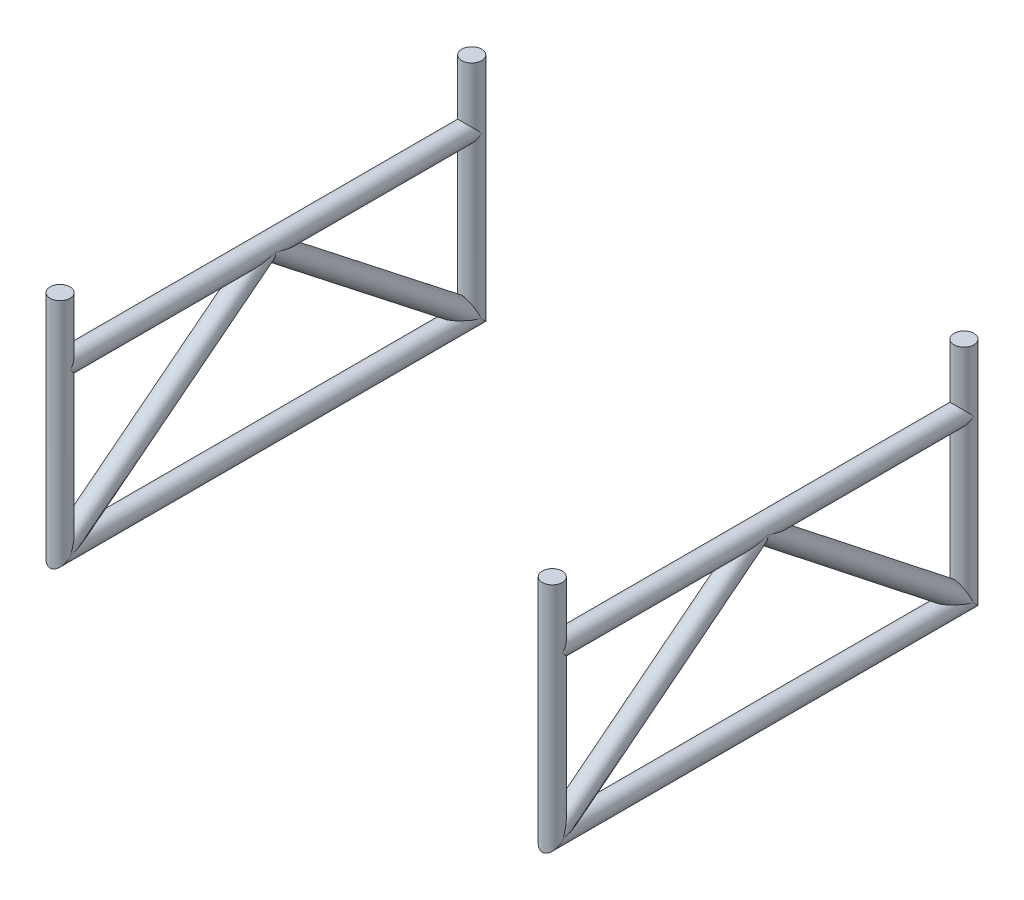
ISO-10303-21;
HEADER;
FILE_DESCRIPTION(('STEP AP214'),'2;1');
FILE_NAME('part.step','',(''),(''),'','','');
FILE_SCHEMA(('AUTOMOTIVE_DESIGN { 1 0 10303 214 1 1 1 1 }'));
ENDSEC;
DATA;
#1=APPLICATION_CONTEXT('core data for automotive mechanical design processes');
#2=APPLICATION_PROTOCOL_DEFINITION('international standard','automotive_design',2000,#1);
#3=PRODUCT_CONTEXT('',#1,'mechanical');
#4=PRODUCT('Part','Part','',(#3));
#5=PRODUCT_RELATED_PRODUCT_CATEGORY('part','',(#4));
#6=PRODUCT_DEFINITION_FORMATION('','',#4);
#7=PRODUCT_DEFINITION_CONTEXT('part definition',#1,'design');
#8=PRODUCT_DEFINITION('design','',#6,#7);
#9=PRODUCT_DEFINITION_SHAPE('','',#8);
#10=(LENGTH_UNIT() NAMED_UNIT(*) SI_UNIT(.MILLI.,.METRE.));
#11=(NAMED_UNIT(*) PLANE_ANGLE_UNIT() SI_UNIT($,.RADIAN.));
#12=(NAMED_UNIT(*) SI_UNIT($,.STERADIAN.) SOLID_ANGLE_UNIT());
#13=UNCERTAINTY_MEASURE_WITH_UNIT(LENGTH_MEASURE(1.E-05),#10,'distance_accuracy_value','');
#14=(GEOMETRIC_REPRESENTATION_CONTEXT(3) GLOBAL_UNCERTAINTY_ASSIGNED_CONTEXT((#13)) GLOBAL_UNIT_ASSIGNED_CONTEXT((#10,
#11,#12)) REPRESENTATION_CONTEXT('',''));
#15=CARTESIAN_POINT('',(0.,0.,0.));
#16=DIRECTION('',(0.,0.,1.));
#17=DIRECTION('',(1.,0.,0.));
#18=AXIS2_PLACEMENT_3D('',#15,#16,#17);
#19=CARTESIAN_POINT('',(-275.,180.,1.66533453693773E-13));
#20=DIRECTION('',(0.,-0.61630826165811,-0.787505001007586));
#21=DIRECTION('',(0.,0.787505001007586,-0.616308261658111));
#22=AXIS2_PLACEMENT_3D('',#19,#20,#21);
#23=CYLINDRICAL_SURFACE('',#22,11.115);
#24=CARTESIAN_POINT('',(-275.,180.,1.11022302462516E-13));
#25=DIRECTION('',(0.,-0.945384842539689,0.325956284639838));
#26=DIRECTION('',(0.,-0.325956284639838,-0.945384842539689));
#27=AXIS2_PLACEMENT_3D('',#24,#25,#26);
#28=ELLIPSE('',#27,34.0996646598835,11.115);
#29=CARTESIAN_POINT('',(-263.885,180.,0.));
#30=VERTEX_POINT('',#29);
#31=CARTESIAN_POINT('',(-286.115,180.,0.));
#32=VERTEX_POINT('',#31);
#33=EDGE_CURVE('E80',#30,#32,#28,.F.);
#34=ORIENTED_EDGE('',*,*,#33,.F.);
#35=CARTESIAN_POINT('',(-275.,180.,0.));
#36=DIRECTION('',(0.,0.,1.));
#37=DIRECTION('',(0.,-1.,0.));
#38=AXIS2_PLACEMENT_3D('',#35,#36,#37);
#39=ELLIPSE('',#38,14.1141960822836,11.115);
#40=EDGE_CURVE('E87',#32,#30,#39,.T.);
#41=ORIENTED_EDGE('',*,*,#40,.F.);
#42=EDGE_LOOP('',(#34,#41));
#43=FACE_BOUND('',#42,.T.);
#44=CARTESIAN_POINT('',(-275.,0.,-230.));
#45=DIRECTION('',(0.,-0.945384842539689,0.325956284639838));
#46=DIRECTION('',(0.,-0.325956284639838,-0.945384842539689));
#47=AXIS2_PLACEMENT_3D('',#44,#45,#46);
#48=ELLIPSE('',#47,34.0996646598835,11.115);
#49=CARTESIAN_POINT('',(-263.885,0.,-230.));
#50=VERTEX_POINT('',#49);
#51=CARTESIAN_POINT('',(-286.115,0.,-230.));
#52=VERTEX_POINT('',#51);
#53=EDGE_CURVE('E93',#50,#52,#48,.T.);
#54=ORIENTED_EDGE('',*,*,#53,.F.);
#55=CARTESIAN_POINT('',(-275.,0.,-230.));
#56=DIRECTION('',(0.,0.438002133751589,-0.898973932229993));
#57=DIRECTION('',(0.,-0.898973932229993,-0.438002133751589));
#58=AXIS2_PLACEMENT_3D('',#55,#56,#57);
#59=ELLIPSE('',#58,25.3765887047113,11.115);
#60=EDGE_CURVE('E13',#52,#50,#59,.T.);
#61=ORIENTED_EDGE('',*,*,#60,.F.);
#62=EDGE_LOOP('',(#54,#61));
#63=FACE_BOUND('',#62,.T.);
#64=ADVANCED_FACE('F57',(#43,#63),#23,.T.);
#65=CARTESIAN_POINT('',(-275.,180.,0.));
#66=DIRECTION('',(0.,0.,1.));
#67=DIRECTION('',(1.,0.,0.));
#68=AXIS2_PLACEMENT_3D('',#65,#66,#67);
#69=PLANE('',#68);
#70=ORIENTED_EDGE('',*,*,#40,.T.);
#71=CARTESIAN_POINT('',(-275.,180.,0.));
#72=DIRECTION('',(0.,0.,1.));
#73=DIRECTION('',(1.,0.,0.));
#74=AXIS2_PLACEMENT_3D('',#71,#72,#73);
#75=CIRCLE('',#74,11.115);
#76=EDGE_CURVE('E83',#30,#32,#75,.F.);
#77=ORIENTED_EDGE('',*,*,#76,.T.);
#78=EDGE_LOOP('',(#70,#77));
#79=FACE_BOUND('',#78,.T.);
#80=ADVANCED_FACE('F89',(#79),#69,.T.);
#81=CARTESIAN_POINT('',(-275.,180.,-230.));
#82=DIRECTION('',(0.,0.,1.));
#83=DIRECTION('',(0.,-1.,0.));
#84=AXIS2_PLACEMENT_3D('',#81,#82,#83);
#85=CYLINDRICAL_SURFACE('',#84,11.115);
#86=ORIENTED_EDGE('',*,*,#33,.T.);
#87=ORIENTED_EDGE('',*,*,#76,.F.);
#88=EDGE_LOOP('',(#86,#87));
#89=FACE_BOUND('',#88,.T.);
#90=ADVANCED_FACE('F85',(#89),#85,.F.);
#91=CARTESIAN_POINT('',(-275.,0.,230.));
#92=DIRECTION('',(0.,0.,-1.));
#93=DIRECTION('',(-1.,0.,0.));
#94=AXIS2_PLACEMENT_3D('',#91,#92,#93);
#95=CYLINDRICAL_SURFACE('',#94,11.115);
#96=ORIENTED_EDGE('',*,*,#53,.T.);
#97=CARTESIAN_POINT('',(-275.,0.,-230.));
#98=DIRECTION('',(0.,0.707106781186548,-0.707106781186548));
#99=DIRECTION('',(0.,-0.707106781186548,-0.707106781186548));
#100=AXIS2_PLACEMENT_3D('',#97,#98,#99);
#101=ELLIPSE('',#100,15.7189837457769,11.115);
#102=EDGE_CURVE('E61',#52,#50,#101,.T.);
#103=ORIENTED_EDGE('',*,*,#102,.T.);
#104=EDGE_LOOP('',(#96,#103));
#105=FACE_BOUND('',#104,.T.);
#106=ADVANCED_FACE('F59',(#105),#95,.F.);
#107=CARTESIAN_POINT('',(-275.,0.,-230.));
#108=DIRECTION('',(0.,1.,0.));
#109=DIRECTION('',(0.,0.,1.));
#110=AXIS2_PLACEMENT_3D('',#107,#108,#109);
#111=CYLINDRICAL_SURFACE('',#110,11.115);
#112=ORIENTED_EDGE('',*,*,#60,.T.);
#113=ORIENTED_EDGE('',*,*,#102,.F.);
#114=EDGE_LOOP('',(#112,#113));
#115=FACE_BOUND('',#114,.T.);
#116=ADVANCED_FACE('F98',(#115),#111,.F.);
#117=CLOSED_SHELL('',(#64,#80,#90,#106,#116));
#118=MANIFOLD_SOLID_BREP('B2',#117);
#119=CARTESIAN_POINT('',(-275.,0.,-230.));
#120=DIRECTION('',(0.,0.999999999999999,0.));
#121=DIRECTION('',(0.,0.,1.));
#122=AXIS2_PLACEMENT_3D('',#119,#120,#121);
#123=CYLINDRICAL_SURFACE('',#122,11.115);
#124=CARTESIAN_POINT('',(-275.,250.,-230.));
#125=DIRECTION('',(0.,-0.999999999999999,0.));
#126=DIRECTION('',(0.,0.,-1.));
#127=AXIS2_PLACEMENT_3D('',#124,#125,#126);
#128=CIRCLE('',#127,11.115);
#129=CARTESIAN_POINT('',(-275.,250.,-241.115));
#130=VERTEX_POINT('',#129);
#131=EDGE_CURVE('E191',#130,#130,#128,.T.);
#132=ORIENTED_EDGE('',*,*,#131,.T.);
#133=EDGE_LOOP('',(#132));
#134=FACE_BOUND('',#133,.T.);
#135=CARTESIAN_POINT('',(-275.,0.,-230.));
#136=DIRECTION('',(0.,-0.707106781186547,0.707106781186547));
#137=DIRECTION('',(0.,0.707106781186547,0.707106781186548));
#138=AXIS2_PLACEMENT_3D('',#135,#136,#137);
#139=ELLIPSE('',#138,15.7189837457769,11.115);
#140=CARTESIAN_POINT('',(-275.,11.115,-218.885));
#141=VERTEX_POINT('',#140);
#142=EDGE_CURVE('E56',#141,#141,#139,.T.);
#143=ORIENTED_EDGE('',*,*,#142,.F.);
#144=EDGE_LOOP('',(#143));
#145=FACE_BOUND('',#144,.T.);
#146=ADVANCED_FACE('F184',(#134,#145),#123,.T.);
#147=CARTESIAN_POINT('',(-275.,250.,-230.));
#148=DIRECTION('',(0.,-0.999999999999999,0.));
#149=DIRECTION('',(0.,0.,-1.));
#150=AXIS2_PLACEMENT_3D('',#147,#148,#149);
#151=PLANE('',#150);
#152=ORIENTED_EDGE('',*,*,#131,.F.);
#153=EDGE_LOOP('',(#152));
#154=FACE_BOUND('',#153,.T.);
#155=ADVANCED_FACE('F199',(#154),#151,.F.);
#156=CARTESIAN_POINT('',(-275.,0.,-230.));
#157=DIRECTION('',(0.,-0.707106781186547,0.707106781186547));
#158=DIRECTION('',(0.,-0.707106781186547,-0.707106781186548));
#159=AXIS2_PLACEMENT_3D('',#156,#157,#158);
#160=PLANE('',#159);
#161=ORIENTED_EDGE('',*,*,#142,.T.);
#162=EDGE_LOOP('',(#161));
#163=FACE_BOUND('',#162,.T.);
#164=ADVANCED_FACE('F186',(#163),#160,.T.);
#165=CLOSED_SHELL('',(#146,#155,#164));
#166=MANIFOLD_SOLID_BREP('B7',#165);
#167=CARTESIAN_POINT('',(-275.,0.,230.));
#168=DIRECTION('',(0.,0.,-1.));
#169=DIRECTION('',(-1.,0.,0.));
#170=AXIS2_PLACEMENT_3D('',#167,#168,#169);
#171=CYLINDRICAL_SURFACE('',#170,11.115);
#172=CARTESIAN_POINT('',(-275.,0.,230.));
#173=DIRECTION('',(0.,0.707106781186547,0.707106781186547));
#174=DIRECTION('',(0.,0.707106781186548,-0.707106781186547));
#175=AXIS2_PLACEMENT_3D('',#172,#173,#174);
#176=ELLIPSE('',#175,15.7189837457769,11.115);
#177=CARTESIAN_POINT('',(-275.,11.115,218.885));
#178=VERTEX_POINT('',#177);
#179=EDGE_CURVE('E268',#178,#178,#176,.T.);
#180=ORIENTED_EDGE('',*,*,#179,.F.);
#181=EDGE_LOOP('',(#180));
#182=FACE_BOUND('',#181,.T.);
#183=CARTESIAN_POINT('',(-275.,0.,-230.));
#184=DIRECTION('',(0.,0.707106781186547,-0.707106781186547));
#185=DIRECTION('',(0.,-0.707106781186548,-0.707106781186547));
#186=AXIS2_PLACEMENT_3D('',#183,#184,#185);
#187=ELLIPSE('',#186,15.7189837457769,11.115);
#188=CARTESIAN_POINT('',(-275.,-11.115,-241.115));
#189=VERTEX_POINT('',#188);
#190=EDGE_CURVE('E183',#189,#189,#187,.T.);
#191=ORIENTED_EDGE('',*,*,#190,.F.);
#192=EDGE_LOOP('',(#191));
#193=FACE_BOUND('',#192,.T.);
#194=ADVANCED_FACE('F261',(#182,#193),#171,.T.);
#195=CARTESIAN_POINT('',(-275.,0.,230.));
#196=DIRECTION('',(0.,0.707106781186547,0.707106781186547));
#197=DIRECTION('',(0.,-0.707106781186548,0.707106781186547));
#198=AXIS2_PLACEMENT_3D('',#195,#196,#197);
#199=PLANE('',#198);
#200=ORIENTED_EDGE('',*,*,#179,.T.);
#201=EDGE_LOOP('',(#200));
#202=FACE_BOUND('',#201,.T.);
#203=ADVANCED_FACE('F274',(#202),#199,.T.);
#204=CARTESIAN_POINT('',(-275.,0.,-230.));
#205=DIRECTION('',(0.,0.707106781186547,-0.707106781186547));
#206=DIRECTION('',(0.,0.707106781186548,0.707106781186547));
#207=AXIS2_PLACEMENT_3D('',#204,#205,#206);
#208=PLANE('',#207);
#209=ORIENTED_EDGE('',*,*,#190,.T.);
#210=EDGE_LOOP('',(#209));
#211=FACE_BOUND('',#210,.T.);
#212=ADVANCED_FACE('F263',(#211),#208,.T.);
#213=CLOSED_SHELL('',(#194,#203,#212));
#214=MANIFOLD_SOLID_BREP('B51',#213);
#215=CARTESIAN_POINT('',(-275.,180.,0.));
#216=DIRECTION('',(0.,0.,-1.));
#217=DIRECTION('',(0.,1.,0.));
#218=AXIS2_PLACEMENT_3D('',#215,#216,#217);
#219=PLANE('',#218);
#220=CARTESIAN_POINT('',(-275.,180.,0.));
#221=DIRECTION('',(0.,0.,-1.));
#222=DIRECTION('',(0.,1.,0.));
#223=AXIS2_PLACEMENT_3D('',#220,#221,#222);
#224=ELLIPSE('',#223,14.1141960822836,11.115);
#225=CARTESIAN_POINT('',(-263.885,180.,0.));
#226=VERTEX_POINT('',#225);
#227=CARTESIAN_POINT('',(-286.115,180.,0.));
#228=VERTEX_POINT('',#227);
#229=EDGE_CURVE('E370',#226,#228,#224,.T.);
#230=ORIENTED_EDGE('',*,*,#229,.T.);
#231=CARTESIAN_POINT('',(-275.,180.,0.));
#232=DIRECTION('',(0.,0.,-1.));
#233=DIRECTION('',(0.,1.,0.));
#234=AXIS2_PLACEMENT_3D('',#231,#232,#233);
#235=CIRCLE('',#234,11.115);
#236=EDGE_CURVE('E359',#228,#226,#235,.F.);
#237=ORIENTED_EDGE('',*,*,#236,.T.);
#238=EDGE_LOOP('',(#230,#237));
#239=FACE_BOUND('',#238,.T.);
#240=ADVANCED_FACE('F338',(#239),#219,.T.);
#241=CARTESIAN_POINT('',(-275.,180.,-230.));
#242=DIRECTION('',(0.,0.,1.));
#243=DIRECTION('',(0.,-1.,0.));
#244=AXIS2_PLACEMENT_3D('',#241,#242,#243);
#245=CYLINDRICAL_SURFACE('',#244,11.115);
#246=CARTESIAN_POINT('',(-275.,180.,0.));
#247=DIRECTION('',(0.,0.945384842539689,0.325956284639838));
#248=DIRECTION('',(0.,0.325956284639838,-0.945384842539689));
#249=AXIS2_PLACEMENT_3D('',#246,#247,#248);
#250=ELLIPSE('',#249,34.0996646598835,11.115);
#251=EDGE_CURVE('E367',#228,#226,#250,.T.);
#252=ORIENTED_EDGE('',*,*,#251,.T.);
#253=ORIENTED_EDGE('',*,*,#236,.F.);
#254=EDGE_LOOP('',(#252,#253));
#255=FACE_BOUND('',#254,.T.);
#256=ADVANCED_FACE('F340',(#255),#245,.F.);
#257=CARTESIAN_POINT('',(-275.,0.,230.));
#258=DIRECTION('',(0.,0.616308261658111,-0.787505001007586));
#259=DIRECTION('',(0.,0.787505001007586,0.616308261658111));
#260=AXIS2_PLACEMENT_3D('',#257,#258,#259);
#261=CYLINDRICAL_SURFACE('',#260,11.115);
#262=ORIENTED_EDGE('',*,*,#251,.F.);
#263=ORIENTED_EDGE('',*,*,#229,.F.);
#264=EDGE_LOOP('',(#262,#263));
#265=FACE_BOUND('',#264,.T.);
#266=CARTESIAN_POINT('',(-275.,0.,230.));
#267=DIRECTION('',(0.,-0.438002133751589,-0.898973932229992));
#268=DIRECTION('',(0.,0.898973932229993,-0.438002133751589));
#269=AXIS2_PLACEMENT_3D('',#266,#267,#268);
#270=ELLIPSE('',#269,25.3765887047113,11.115);
#271=CARTESIAN_POINT('',(-263.885,0.,230.));
#272=VERTEX_POINT('',#271);
#273=CARTESIAN_POINT('',(-286.115,0.,230.));
#274=VERTEX_POINT('',#273);
#275=EDGE_CURVE('E259',#272,#274,#270,.F.);
#276=ORIENTED_EDGE('',*,*,#275,.F.);
#277=CARTESIAN_POINT('',(-275.,0.,230.));
#278=DIRECTION('',(0.,0.945384842539689,0.325956284639838));
#279=DIRECTION('',(0.,0.325956284639838,-0.945384842539689));
#280=AXIS2_PLACEMENT_3D('',#277,#278,#279);
#281=ELLIPSE('',#280,34.0996646598835,11.115);
#282=EDGE_CURVE('E346',#274,#272,#281,.F.);
#283=ORIENTED_EDGE('',*,*,#282,.F.);
#284=EDGE_LOOP('',(#276,#283));
#285=FACE_BOUND('',#284,.T.);
#286=ADVANCED_FACE('F372',(#265,#285),#261,.T.);
#287=CARTESIAN_POINT('',(-275.,0.,230.));
#288=DIRECTION('',(0.,0.,-1.));
#289=DIRECTION('',(-1.,0.,0.));
#290=AXIS2_PLACEMENT_3D('',#287,#288,#289);
#291=CYLINDRICAL_SURFACE('',#290,11.115);
#292=ORIENTED_EDGE('',*,*,#282,.T.);
#293=CARTESIAN_POINT('',(-275.,0.,230.));
#294=DIRECTION('',(0.,-0.707106781186547,-0.707106781186547));
#295=DIRECTION('',(0.,-0.707106781186547,0.707106781186547));
#296=AXIS2_PLACEMENT_3D('',#293,#294,#295);
#297=ELLIPSE('',#296,15.7189837457769,11.115);
#298=EDGE_CURVE('E352',#274,#272,#297,.T.);
#299=ORIENTED_EDGE('',*,*,#298,.F.);
#300=EDGE_LOOP('',(#292,#299));
#301=FACE_BOUND('',#300,.T.);
#302=ADVANCED_FACE('F364',(#301),#291,.F.);
#303=CARTESIAN_POINT('',(-275.,250.,230.));
#304=DIRECTION('',(0.,-1.,0.));
#305=DIRECTION('',(0.,0.,-1.));
#306=AXIS2_PLACEMENT_3D('',#303,#304,#305);
#307=CYLINDRICAL_SURFACE('',#306,11.115);
#308=ORIENTED_EDGE('',*,*,#275,.T.);
#309=ORIENTED_EDGE('',*,*,#298,.T.);
#310=EDGE_LOOP('',(#308,#309));
#311=FACE_BOUND('',#310,.T.);
#312=ADVANCED_FACE('F369',(#311),#307,.F.);
#313=CLOSED_SHELL('',(#240,#256,#286,#302,#312));
#314=MANIFOLD_SOLID_BREP('B178',#313);
#315=CARTESIAN_POINT('',(-275.,250.,230.));
#316=DIRECTION('',(0.,-1.,0.));
#317=DIRECTION('',(0.,0.,-1.));
#318=AXIS2_PLACEMENT_3D('',#315,#316,#317);
#319=CYLINDRICAL_SURFACE('',#318,11.115);
#320=CARTESIAN_POINT('',(-275.,250.,230.));
#321=DIRECTION('',(0.,1.,0.));
#322=DIRECTION('',(0.,0.,1.));
#323=AXIS2_PLACEMENT_3D('',#320,#321,#322);
#324=CIRCLE('',#323,11.115);
#325=CARTESIAN_POINT('',(-275.,250.,241.115));
#326=VERTEX_POINT('',#325);
#327=EDGE_CURVE('E474',#326,#326,#324,.T.);
#328=ORIENTED_EDGE('',*,*,#327,.F.);
#329=EDGE_LOOP('',(#328));
#330=FACE_BOUND('',#329,.T.);
#331=CARTESIAN_POINT('',(-275.,0.,230.));
#332=DIRECTION('',(0.,-0.707106781186548,-0.707106781186548));
#333=DIRECTION('',(0.,-0.707106781186547,0.707106781186548));
#334=AXIS2_PLACEMENT_3D('',#331,#332,#333);
#335=ELLIPSE('',#334,15.7189837457769,11.115);
#336=CARTESIAN_POINT('',(-275.,-11.115,241.115));
#337=VERTEX_POINT('',#336);
#338=EDGE_CURVE('E337',#337,#337,#335,.T.);
#339=ORIENTED_EDGE('',*,*,#338,.F.);
#340=EDGE_LOOP('',(#339));
#341=FACE_BOUND('',#340,.T.);
#342=ADVANCED_FACE('F467',(#330,#341),#319,.T.);
#343=CARTESIAN_POINT('',(-275.,250.,230.));
#344=DIRECTION('',(0.,1.,0.));
#345=DIRECTION('',(0.,0.,1.));
#346=AXIS2_PLACEMENT_3D('',#343,#344,#345);
#347=PLANE('',#346);
#348=ORIENTED_EDGE('',*,*,#327,.T.);
#349=EDGE_LOOP('',(#348));
#350=FACE_BOUND('',#349,.T.);
#351=ADVANCED_FACE('F480',(#350),#347,.T.);
#352=CARTESIAN_POINT('',(-275.,0.,230.));
#353=DIRECTION('',(0.,-0.707106781186548,-0.707106781186548));
#354=DIRECTION('',(0.,0.707106781186547,-0.707106781186548));
#355=AXIS2_PLACEMENT_3D('',#352,#353,#354);
#356=PLANE('',#355);
#357=ORIENTED_EDGE('',*,*,#338,.T.);
#358=EDGE_LOOP('',(#357));
#359=FACE_BOUND('',#358,.T.);
#360=ADVANCED_FACE('F469',(#359),#356,.T.);
#361=CLOSED_SHELL('',(#342,#351,#360));
#362=MANIFOLD_SOLID_BREP('B253',#361);
#363=CARTESIAN_POINT('',(275.,181.072718420075,1.38777878078145E-13));
#364=DIRECTION('',(0.,0.,-1.));
#365=DIRECTION('',(0.,1.,0.));
#366=AXIS2_PLACEMENT_3D('',#363,#364,#365);
#367=PLANE('',#366);
#368=CARTESIAN_POINT('',(275.,181.072718420075,1.2490009027033E-13));
#369=DIRECTION('',(0.,0.,-1.));
#370=DIRECTION('',(0.,1.,0.));
#371=AXIS2_PLACEMENT_3D('',#368,#369,#370);
#372=ELLIPSE('',#371,14.1462045851217,11.115);
#373=CARTESIAN_POINT('',(286.115,181.072718420075,1.11022302462516E-13));
#374=VERTEX_POINT('',#373);
#375=CARTESIAN_POINT('',(263.885,181.072718420075,1.38777878078145E-13));
#376=VERTEX_POINT('',#375);
#377=EDGE_CURVE('E574',#374,#376,#372,.T.);
#378=ORIENTED_EDGE('',*,*,#377,.T.);
#379=CARTESIAN_POINT('',(275.,181.072718420075,1.38777878078145E-13));
#380=DIRECTION('',(0.,0.,-1.));
#381=DIRECTION('',(0.,1.,0.));
#382=AXIS2_PLACEMENT_3D('',#379,#380,#381);
#383=CIRCLE('',#382,11.115);
#384=EDGE_CURVE('E563',#376,#374,#383,.F.);
#385=ORIENTED_EDGE('',*,*,#384,.T.);
#386=EDGE_LOOP('',(#378,#385));
#387=FACE_BOUND('',#386,.T.);
#388=ADVANCED_FACE('F542',(#387),#367,.T.);
#389=CARTESIAN_POINT('',(275.,181.072718420075,230.));
#390=DIRECTION('',(0.,0.,-1.));
#391=DIRECTION('',(-1.,0.,0.));
#392=AXIS2_PLACEMENT_3D('',#389,#390,#391);
#393=CYLINDRICAL_SURFACE('',#392,11.115);
#394=CARTESIAN_POINT('',(275.,181.072718420075,0.));
#395=DIRECTION('',(0.,0.944913519800482,0.327320088137383));
#396=DIRECTION('',(0.,0.327320088137383,-0.944913519800482));
#397=AXIS2_PLACEMENT_3D('',#394,#395,#396);
#398=ELLIPSE('',#397,33.957585870302,11.115);
#399=EDGE_CURVE('E571',#376,#374,#398,.T.);
#400=ORIENTED_EDGE('',*,*,#399,.T.);
#401=ORIENTED_EDGE('',*,*,#384,.F.);
#402=EDGE_LOOP('',(#400,#401));
#403=FACE_BOUND('',#402,.T.);
#404=ADVANCED_FACE('F544',(#403),#393,.F.);
#405=CARTESIAN_POINT('',(275.,0.,230.));
#406=DIRECTION('',(0.,0.618578353166597,-0.785723119803472));
#407=DIRECTION('',(0.,0.785723119803472,0.618578353166597));
#408=AXIS2_PLACEMENT_3D('',#405,#406,#407);
#409=CYLINDRICAL_SURFACE('',#408,11.115);
#410=ORIENTED_EDGE('',*,*,#399,.F.);
#411=ORIENTED_EDGE('',*,*,#377,.F.);
#412=EDGE_LOOP('',(#410,#411));
#413=FACE_BOUND('',#412,.T.);
#414=CARTESIAN_POINT('',(275.,0.,230.));
#415=DIRECTION('',(0.,0.944913519800482,0.327320088137383));
#416=DIRECTION('',(0.,0.327320088137383,-0.944913519800482));
#417=AXIS2_PLACEMENT_3D('',#414,#415,#416);
#418=ELLIPSE('',#417,33.957585870302,11.115);
#419=CARTESIAN_POINT('',(263.885,0.,230.));
#420=VERTEX_POINT('',#419);
#421=CARTESIAN_POINT('',(286.115,0.,230.));
#422=VERTEX_POINT('',#421);
#423=EDGE_CURVE('E465',#420,#422,#418,.F.);
#424=ORIENTED_EDGE('',*,*,#423,.F.);
#425=CARTESIAN_POINT('',(275.,0.,230.));
#426=DIRECTION('',(0.,-0.436704503545248,-0.899605011426292));
#427=DIRECTION('',(0.,0.899605011426292,-0.436704503545248));
#428=AXIS2_PLACEMENT_3D('',#425,#426,#427);
#429=ELLIPSE('',#428,25.4519930748741,11.115);
#430=EDGE_CURVE('E550',#422,#420,#429,.F.);
#431=ORIENTED_EDGE('',*,*,#430,.F.);
#432=EDGE_LOOP('',(#424,#431));
#433=FACE_BOUND('',#432,.T.);
#434=ADVANCED_FACE('F576',(#413,#433),#409,.T.);
#435=CARTESIAN_POINT('',(275.,0.,230.));
#436=DIRECTION('',(0.,1.,0.));
#437=DIRECTION('',(0.,0.,1.));
#438=AXIS2_PLACEMENT_3D('',#435,#436,#437);
#439=CYLINDRICAL_SURFACE('',#438,11.115);
#440=ORIENTED_EDGE('',*,*,#430,.T.);
#441=CARTESIAN_POINT('',(275.,0.,230.));
#442=DIRECTION('',(0.,0.707106781186548,0.707106781186548));
#443=DIRECTION('',(0.,-0.707106781186548,0.707106781186547));
#444=AXIS2_PLACEMENT_3D('',#441,#442,#443);
#445=ELLIPSE('',#444,15.7189837457769,11.115);
#446=EDGE_CURVE('E556',#422,#420,#445,.T.);
#447=ORIENTED_EDGE('',*,*,#446,.F.);
#448=EDGE_LOOP('',(#440,#447));
#449=FACE_BOUND('',#448,.T.);
#450=ADVANCED_FACE('F568',(#449),#439,.F.);
#451=CARTESIAN_POINT('',(275.,0.,-230.));
#452=DIRECTION('',(0.,0.,1.));
#453=DIRECTION('',(1.,0.,0.));
#454=AXIS2_PLACEMENT_3D('',#451,#452,#453);
#455=CYLINDRICAL_SURFACE('',#454,11.115);
#456=ORIENTED_EDGE('',*,*,#423,.T.);
#457=ORIENTED_EDGE('',*,*,#446,.T.);
#458=EDGE_LOOP('',(#456,#457));
#459=FACE_BOUND('',#458,.T.);
#460=ADVANCED_FACE('F573',(#459),#455,.F.);
#461=CLOSED_SHELL('',(#388,#404,#434,#450,#460));
#462=MANIFOLD_SOLID_BREP('B332',#461);
#463=CARTESIAN_POINT('',(275.,0.,230.));
#464=DIRECTION('',(0.,1.,0.));
#465=DIRECTION('',(0.,0.,1.));
#466=AXIS2_PLACEMENT_3D('',#463,#464,#465);
#467=CYLINDRICAL_SURFACE('',#466,11.115);
#468=CARTESIAN_POINT('',(275.,250.,230.));
#469=DIRECTION('',(0.,-1.,0.));
#470=DIRECTION('',(0.,0.,-1.));
#471=AXIS2_PLACEMENT_3D('',#468,#469,#470);
#472=CIRCLE('',#471,11.115);
#473=CARTESIAN_POINT('',(275.,250.,218.885));
#474=VERTEX_POINT('',#473);
#475=EDGE_CURVE('E676',#474,#474,#472,.T.);
#476=ORIENTED_EDGE('',*,*,#475,.T.);
#477=EDGE_LOOP('',(#476));
#478=FACE_BOUND('',#477,.T.);
#479=CARTESIAN_POINT('',(275.,0.,230.));
#480=DIRECTION('',(0.,-0.707106781186548,-0.707106781186548));
#481=DIRECTION('',(0.,0.707106781186548,-0.707106781186548));
#482=AXIS2_PLACEMENT_3D('',#479,#480,#481);
#483=ELLIPSE('',#482,15.718983745777,11.115);
#484=CARTESIAN_POINT('',(275.,11.115,218.885));
#485=VERTEX_POINT('',#484);
#486=EDGE_CURVE('E541',#485,#485,#483,.T.);
#487=ORIENTED_EDGE('',*,*,#486,.F.);
#488=EDGE_LOOP('',(#487));
#489=FACE_BOUND('',#488,.T.);
#490=ADVANCED_FACE('F669',(#478,#489),#467,.T.);
#491=CARTESIAN_POINT('',(275.,250.,230.));
#492=DIRECTION('',(0.,-1.,0.));
#493=DIRECTION('',(0.,0.,-1.));
#494=AXIS2_PLACEMENT_3D('',#491,#492,#493);
#495=PLANE('',#494);
#496=ORIENTED_EDGE('',*,*,#475,.F.);
#497=EDGE_LOOP('',(#496));
#498=FACE_BOUND('',#497,.T.);
#499=ADVANCED_FACE('F684',(#498),#495,.F.);
#500=CARTESIAN_POINT('',(275.,0.,230.));
#501=DIRECTION('',(0.,-0.707106781186548,-0.707106781186548));
#502=DIRECTION('',(0.,0.707106781186548,-0.707106781186548));
#503=AXIS2_PLACEMENT_3D('',#500,#501,#502);
#504=PLANE('',#503);
#505=ORIENTED_EDGE('',*,*,#486,.T.);
#506=EDGE_LOOP('',(#505));
#507=FACE_BOUND('',#506,.T.);
#508=ADVANCED_FACE('F671',(#507),#504,.T.);
#509=CLOSED_SHELL('',(#490,#499,#508));
#510=MANIFOLD_SOLID_BREP('B459',#509);
#511=CARTESIAN_POINT('',(275.,0.,-230.));
#512=DIRECTION('',(0.,0.,1.));
#513=DIRECTION('',(1.,0.,0.));
#514=AXIS2_PLACEMENT_3D('',#511,#512,#513);
#515=CYLINDRICAL_SURFACE('',#514,11.115);
#516=CARTESIAN_POINT('',(275.,0.,-230.));
#517=DIRECTION('',(0.,0.707106781186547,-0.707106781186547));
#518=DIRECTION('',(0.,0.707106781186547,0.707106781186547));
#519=AXIS2_PLACEMENT_3D('',#516,#517,#518);
#520=ELLIPSE('',#519,15.718983745777,11.115);
#521=CARTESIAN_POINT('',(275.,11.115,-218.885));
#522=VERTEX_POINT('',#521);
#523=EDGE_CURVE('E753',#522,#522,#520,.T.);
#524=ORIENTED_EDGE('',*,*,#523,.F.);
#525=EDGE_LOOP('',(#524));
#526=FACE_BOUND('',#525,.T.);
#527=CARTESIAN_POINT('',(275.,0.,230.));
#528=DIRECTION('',(0.,0.707106781186547,0.707106781186548));
#529=DIRECTION('',(0.,-0.707106781186548,0.707106781186547));
#530=AXIS2_PLACEMENT_3D('',#527,#528,#529);
#531=ELLIPSE('',#530,15.7189837457769,11.115);
#532=CARTESIAN_POINT('',(275.,-11.115,241.115));
#533=VERTEX_POINT('',#532);
#534=EDGE_CURVE('E668',#533,#533,#531,.T.);
#535=ORIENTED_EDGE('',*,*,#534,.F.);
#536=EDGE_LOOP('',(#535));
#537=FACE_BOUND('',#536,.T.);
#538=ADVANCED_FACE('F746',(#526,#537),#515,.T.);
#539=CARTESIAN_POINT('',(275.,0.,-230.));
#540=DIRECTION('',(0.,0.707106781186547,-0.707106781186547));
#541=DIRECTION('',(0.,0.707106781186547,0.707106781186547));
#542=AXIS2_PLACEMENT_3D('',#539,#540,#541);
#543=PLANE('',#542);
#544=ORIENTED_EDGE('',*,*,#523,.T.);
#545=EDGE_LOOP('',(#544));
#546=FACE_BOUND('',#545,.T.);
#547=ADVANCED_FACE('F759',(#546),#543,.T.);
#548=CARTESIAN_POINT('',(275.,0.,230.));
#549=DIRECTION('',(0.,0.707106781186547,0.707106781186548));
#550=DIRECTION('',(0.,-0.707106781186548,0.707106781186547));
#551=AXIS2_PLACEMENT_3D('',#548,#549,#550);
#552=PLANE('',#551);
#553=ORIENTED_EDGE('',*,*,#534,.T.);
#554=EDGE_LOOP('',(#553));
#555=FACE_BOUND('',#554,.T.);
#556=ADVANCED_FACE('F748',(#555),#552,.T.);
#557=CLOSED_SHELL('',(#538,#547,#556));
#558=MANIFOLD_SOLID_BREP('B536',#557);
#559=CARTESIAN_POINT('',(275.,181.072718420075,0.));
#560=DIRECTION('',(0.,-0.618578353166597,-0.785723119803472));
#561=DIRECTION('',(0.,0.785723119803472,-0.618578353166597));
#562=AXIS2_PLACEMENT_3D('',#559,#560,#561);
#563=CYLINDRICAL_SURFACE('',#562,11.115);
#564=CARTESIAN_POINT('',(275.,181.072718420075,1.52655665885959E-13));
#565=DIRECTION('',(0.,-0.944913519800482,0.327320088137383));
#566=DIRECTION('',(0.,-0.327320088137383,-0.944913519800482));
#567=AXIS2_PLACEMENT_3D('',#564,#565,#566);
#568=ELLIPSE('',#567,33.957585870302,11.115);
#569=CARTESIAN_POINT('',(286.115,181.072718420075,1.38777878078145E-13));
#570=VERTEX_POINT('',#569);
#571=CARTESIAN_POINT('',(263.885,181.072718420075,1.38777878078145E-13));
#572=VERTEX_POINT('',#571);
#573=EDGE_CURVE('E848',#570,#572,#568,.F.);
#574=ORIENTED_EDGE('',*,*,#573,.F.);
#575=CARTESIAN_POINT('',(275.,181.072718420075,1.38777878078145E-13));
#576=DIRECTION('',(0.,0.,1.));
#577=DIRECTION('',(0.,-1.,0.));
#578=AXIS2_PLACEMENT_3D('',#575,#576,#577);
#579=ELLIPSE('',#578,14.1462045851217,11.115);
#580=EDGE_CURVE('E856',#572,#570,#579,.T.);
#581=ORIENTED_EDGE('',*,*,#580,.F.);
#582=EDGE_LOOP('',(#574,#581));
#583=FACE_BOUND('',#582,.T.);
#584=CARTESIAN_POINT('',(275.,0.,-230.));
#585=DIRECTION('',(0.,0.436704503545248,-0.899605011426291));
#586=DIRECTION('',(0.,-0.899605011426292,-0.436704503545248));
#587=AXIS2_PLACEMENT_3D('',#584,#585,#586);
#588=ELLIPSE('',#587,25.4519930748741,11.115);
#589=CARTESIAN_POINT('',(263.885,0.,-230.));
#590=VERTEX_POINT('',#589);
#591=CARTESIAN_POINT('',(286.115,0.,-230.));
#592=VERTEX_POINT('',#591);
#593=EDGE_CURVE('E853',#590,#592,#588,.T.);
#594=ORIENTED_EDGE('',*,*,#593,.F.);
#595=CARTESIAN_POINT('',(275.,0.,-230.));
#596=DIRECTION('',(0.,-0.944913519800482,0.327320088137383));
#597=DIRECTION('',(0.,-0.327320088137383,-0.944913519800482));
#598=AXIS2_PLACEMENT_3D('',#595,#596,#597);
#599=ELLIPSE('',#598,33.957585870302,11.115);
#600=EDGE_CURVE('E744',#592,#590,#599,.T.);
#601=ORIENTED_EDGE('',*,*,#600,.F.);
#602=EDGE_LOOP('',(#594,#601));
#603=FACE_BOUND('',#602,.T.);
#604=ADVANCED_FACE('F823',(#583,#603),#563,.T.);
#605=CARTESIAN_POINT('',(275.,181.072718420075,1.38777878078145E-13));
#606=DIRECTION('',(0.,0.,1.));
#607=DIRECTION('',(0.,-1.,0.));
#608=AXIS2_PLACEMENT_3D('',#605,#606,#607);
#609=PLANE('',#608);
#610=ORIENTED_EDGE('',*,*,#580,.T.);
#611=CARTESIAN_POINT('',(275.,181.072718420075,1.52655665885959E-13));
#612=DIRECTION('',(0.,0.,1.));
#613=DIRECTION('',(0.,-1.,0.));
#614=AXIS2_PLACEMENT_3D('',#611,#612,#613);
#615=CIRCLE('',#614,11.115);
#616=EDGE_CURVE('E846',#570,#572,#615,.F.);
#617=ORIENTED_EDGE('',*,*,#616,.T.);
#618=EDGE_LOOP('',(#610,#617));
#619=FACE_BOUND('',#618,.T.);
#620=ADVANCED_FACE('F855',(#619),#609,.T.);
#621=CARTESIAN_POINT('',(275.,181.072718420075,230.));
#622=DIRECTION('',(0.,0.,-1.));
#623=DIRECTION('',(-1.,0.,0.));
#624=AXIS2_PLACEMENT_3D('',#621,#622,#623);
#625=CYLINDRICAL_SURFACE('',#624,11.115);
#626=ORIENTED_EDGE('',*,*,#573,.T.);
#627=ORIENTED_EDGE('',*,*,#616,.F.);
#628=EDGE_LOOP('',(#626,#627));
#629=FACE_BOUND('',#628,.T.);
#630=ADVANCED_FACE('F849',(#629),#625,.F.);
#631=CARTESIAN_POINT('',(275.,250.,-230.));
#632=DIRECTION('',(0.,-1.,0.));
#633=DIRECTION('',(0.,0.,-1.));
#634=AXIS2_PLACEMENT_3D('',#631,#632,#633);
#635=CYLINDRICAL_SURFACE('',#634,11.115);
#636=ORIENTED_EDGE('',*,*,#593,.T.);
#637=CARTESIAN_POINT('',(275.,0.,-230.));
#638=DIRECTION('',(0.,-0.707106781186547,0.707106781186547));
#639=DIRECTION('',(0.,-0.707106781186548,-0.707106781186548));
#640=AXIS2_PLACEMENT_3D('',#637,#638,#639);
#641=ELLIPSE('',#640,15.7189837457769,11.115);
#642=EDGE_CURVE('E827',#592,#590,#641,.T.);
#643=ORIENTED_EDGE('',*,*,#642,.T.);
#644=EDGE_LOOP('',(#636,#643));
#645=FACE_BOUND('',#644,.T.);
#646=ADVANCED_FACE('F825',(#645),#635,.F.);
#647=CARTESIAN_POINT('',(275.,0.,-230.));
#648=DIRECTION('',(0.,0.,1.));
#649=DIRECTION('',(1.,0.,0.));
#650=AXIS2_PLACEMENT_3D('',#647,#648,#649);
#651=CYLINDRICAL_SURFACE('',#650,11.115);
#652=ORIENTED_EDGE('',*,*,#600,.T.);
#653=ORIENTED_EDGE('',*,*,#642,.F.);
#654=EDGE_LOOP('',(#652,#653));
#655=FACE_BOUND('',#654,.T.);
#656=ADVANCED_FACE('F864',(#655),#651,.F.);
#657=CLOSED_SHELL('',(#604,#620,#630,#646,#656));
#658=MANIFOLD_SOLID_BREP('B663',#657);
#659=CARTESIAN_POINT('',(275.,250.,-230.));
#660=DIRECTION('',(0.,-1.,0.));
#661=DIRECTION('',(0.,0.,-1.));
#662=AXIS2_PLACEMENT_3D('',#659,#660,#661);
#663=CYLINDRICAL_SURFACE('',#662,11.115);
#664=CARTESIAN_POINT('',(275.,250.,-230.));
#665=DIRECTION('',(0.,1.,0.));
#666=DIRECTION('',(0.,0.,1.));
#667=AXIS2_PLACEMENT_3D('',#664,#665,#666);
#668=CIRCLE('',#667,11.115);
#669=CARTESIAN_POINT('',(275.,250.,-218.885));
#670=VERTEX_POINT('',#669);
#671=EDGE_CURVE('E959',#670,#670,#668,.T.);
#672=ORIENTED_EDGE('',*,*,#671,.F.);
#673=EDGE_LOOP('',(#672));
#674=FACE_BOUND('',#673,.T.);
#675=CARTESIAN_POINT('',(275.,0.,-230.));
#676=DIRECTION('',(0.,-0.707106781186548,0.707106781186548));
#677=DIRECTION('',(0.,-0.707106781186547,-0.707106781186548));
#678=AXIS2_PLACEMENT_3D('',#675,#676,#677);
#679=ELLIPSE('',#678,15.7189837457769,11.115);
#680=CARTESIAN_POINT('',(275.,-11.115,-241.115));
#681=VERTEX_POINT('',#680);
#682=EDGE_CURVE('E822',#681,#681,#679,.T.);
#683=ORIENTED_EDGE('',*,*,#682,.F.);
#684=EDGE_LOOP('',(#683));
#685=FACE_BOUND('',#684,.T.);
#686=ADVANCED_FACE('F952',(#674,#685),#663,.T.);
#687=CARTESIAN_POINT('',(275.,250.,-230.));
#688=DIRECTION('',(0.,1.,0.));
#689=DIRECTION('',(0.,0.,1.));
#690=AXIS2_PLACEMENT_3D('',#687,#688,#689);
#691=PLANE('',#690);
#692=ORIENTED_EDGE('',*,*,#671,.T.);
#693=EDGE_LOOP('',(#692));
#694=FACE_BOUND('',#693,.T.);
#695=ADVANCED_FACE('F965',(#694),#691,.T.);
#696=CARTESIAN_POINT('',(275.,0.,-230.));
#697=DIRECTION('',(0.,-0.707106781186548,0.707106781186548));
#698=DIRECTION('',(0.,-0.707106781186547,-0.707106781186548));
#699=AXIS2_PLACEMENT_3D('',#696,#697,#698);
#700=PLANE('',#699);
#701=ORIENTED_EDGE('',*,*,#682,.T.);
#702=EDGE_LOOP('',(#701));
#703=FACE_BOUND('',#702,.T.);
#704=ADVANCED_FACE('F954',(#703),#700,.T.);
#705=CLOSED_SHELL('',(#686,#695,#704));
#706=MANIFOLD_SOLID_BREP('B738',#705);
#707=CARTESIAN_POINT('',(-275.,180.,-230.));
#708=DIRECTION('',(0.,0.,1.));
#709=DIRECTION('',(0.,-1.,0.));
#710=AXIS2_PLACEMENT_3D('',#707,#708,#709);
#711=CYLINDRICAL_SURFACE('',#710,11.115);
#712=CARTESIAN_POINT('',(-275.,180.,-230.));
#713=DIRECTION('',(0.,0.707106781186548,0.707106781186547));
#714=DIRECTION('',(0.,-0.707106781186547,0.707106781186548));
#715=AXIS2_PLACEMENT_3D('',#712,#713,#714);
#716=ELLIPSE('',#715,15.7189837457769,11.115);
#717=CARTESIAN_POINT('',(-263.885,180.,-230.));
#718=VERTEX_POINT('',#717);
#719=CARTESIAN_POINT('',(-286.115,180.,-230.));
#720=VERTEX_POINT('',#719);
#721=EDGE_CURVE('E1052',#718,#720,#716,.F.);
#722=ORIENTED_EDGE('',*,*,#721,.F.);
#723=CARTESIAN_POINT('',(-275.,180.,-230.));
#724=DIRECTION('',(0.,-0.707106781186547,0.707106781186548));
#725=DIRECTION('',(0.,0.707106781186548,0.707106781186547));
#726=AXIS2_PLACEMENT_3D('',#723,#724,#725);
#727=ELLIPSE('',#726,15.718983745777,11.115);
#728=EDGE_CURVE('E1032',#720,#718,#727,.F.);
#729=ORIENTED_EDGE('',*,*,#728,.F.);
#730=EDGE_LOOP('',(#722,#729));
#731=FACE_BOUND('',#730,.T.);
#732=CARTESIAN_POINT('',(-275.,180.,230.));
#733=DIRECTION('',(0.,-0.707106781186547,0.707106781186548));
#734=DIRECTION('',(0.,0.707106781186548,0.707106781186547));
#735=AXIS2_PLACEMENT_3D('',#732,#733,#734);
#736=ELLIPSE('',#735,15.718983745777,11.115);
#737=CARTESIAN_POINT('',(-286.115,180.,230.));
#738=VERTEX_POINT('',#737);
#739=CARTESIAN_POINT('',(-263.885,180.,230.));
#740=VERTEX_POINT('',#739);
#741=EDGE_CURVE('E1038',#738,#740,#736,.T.);
#742=ORIENTED_EDGE('',*,*,#741,.F.);
#743=CARTESIAN_POINT('',(-275.,180.,230.));
#744=DIRECTION('',(0.,0.707106781186548,0.707106781186547));
#745=DIRECTION('',(0.,-0.707106781186547,0.707106781186548));
#746=AXIS2_PLACEMENT_3D('',#743,#744,#745);
#747=ELLIPSE('',#746,15.7189837457769,11.115);
#748=EDGE_CURVE('E950',#740,#738,#747,.T.);
#749=ORIENTED_EDGE('',*,*,#748,.F.);
#750=EDGE_LOOP('',(#742,#749));
#751=FACE_BOUND('',#750,.T.);
#752=ADVANCED_FACE('F1028',(#731,#751),#711,.T.);
#753=CARTESIAN_POINT('',(-275.,0.,-230.));
#754=DIRECTION('',(0.,1.,0.));
#755=DIRECTION('',(0.,0.,1.));
#756=AXIS2_PLACEMENT_3D('',#753,#754,#755);
#757=CYLINDRICAL_SURFACE('',#756,11.115);
#758=ORIENTED_EDGE('',*,*,#721,.T.);
#759=ORIENTED_EDGE('',*,*,#728,.T.);
#760=EDGE_LOOP('',(#758,#759));
#761=FACE_BOUND('',#760,.T.);
#762=ADVANCED_FACE('F1054',(#761),#757,.F.);
#763=CARTESIAN_POINT('',(-275.,250.,230.));
#764=DIRECTION('',(0.,-1.,0.));
#765=DIRECTION('',(0.,0.,-1.));
#766=AXIS2_PLACEMENT_3D('',#763,#764,#765);
#767=CYLINDRICAL_SURFACE('',#766,11.115);
#768=ORIENTED_EDGE('',*,*,#741,.T.);
#769=ORIENTED_EDGE('',*,*,#748,.T.);
#770=EDGE_LOOP('',(#768,#769));
#771=FACE_BOUND('',#770,.T.);
#772=ADVANCED_FACE('F1030',(#771),#767,.F.);
#773=CLOSED_SHELL('',(#752,#762,#772));
#774=MANIFOLD_SOLID_BREP('B817',#773);
#775=CARTESIAN_POINT('',(275.,181.072718420075,230.));
#776=DIRECTION('',(0.,0.,-1.));
#777=DIRECTION('',(-1.,0.,0.));
#778=AXIS2_PLACEMENT_3D('',#775,#776,#777);
#779=CYLINDRICAL_SURFACE('',#778,11.115);
#780=CARTESIAN_POINT('',(275.,181.072718420075,230.));
#781=DIRECTION('',(0.,0.707106781186548,-0.707106781186547));
#782=DIRECTION('',(0.,-0.707106781186547,-0.707106781186548));
#783=AXIS2_PLACEMENT_3D('',#780,#781,#782);
#784=ELLIPSE('',#783,15.7189837457769,11.115);
#785=CARTESIAN_POINT('',(263.885,181.072718420075,230.));
#786=VERTEX_POINT('',#785);
#787=CARTESIAN_POINT('',(286.115,181.072718420075,230.));
#788=VERTEX_POINT('',#787);
#789=EDGE_CURVE('E1135',#786,#788,#784,.F.);
#790=ORIENTED_EDGE('',*,*,#789,.F.);
#791=CARTESIAN_POINT('',(275.,181.072718420075,230.));
#792=DIRECTION('',(0.,-0.707106781186547,-0.707106781186548));
#793=DIRECTION('',(0.,0.707106781186548,-0.707106781186547));
#794=AXIS2_PLACEMENT_3D('',#791,#792,#793);
#795=ELLIPSE('',#794,15.718983745777,11.115);
#796=EDGE_CURVE('E1115',#788,#786,#795,.F.);
#797=ORIENTED_EDGE('',*,*,#796,.F.);
#798=EDGE_LOOP('',(#790,#797));
#799=FACE_BOUND('',#798,.T.);
#800=CARTESIAN_POINT('',(275.,181.072718420075,-230.));
#801=DIRECTION('',(0.,-0.707106781186547,-0.707106781186548));
#802=DIRECTION('',(0.,0.707106781186548,-0.707106781186547));
#803=AXIS2_PLACEMENT_3D('',#800,#801,#802);
#804=ELLIPSE('',#803,15.718983745777,11.115);
#805=CARTESIAN_POINT('',(286.115,181.072718420075,-230.));
#806=VERTEX_POINT('',#805);
#807=CARTESIAN_POINT('',(263.885,181.072718420075,-230.));
#808=VERTEX_POINT('',#807);
#809=EDGE_CURVE('E1121',#806,#808,#804,.T.);
#810=ORIENTED_EDGE('',*,*,#809,.F.);
#811=CARTESIAN_POINT('',(275.,181.072718420075,-230.));
#812=DIRECTION('',(0.,0.707106781186548,-0.707106781186547));
#813=DIRECTION('',(0.,-0.707106781186547,-0.707106781186548));
#814=AXIS2_PLACEMENT_3D('',#811,#812,#813);
#815=ELLIPSE('',#814,15.7189837457769,11.115);
#816=EDGE_CURVE('E1026',#808,#806,#815,.T.);
#817=ORIENTED_EDGE('',*,*,#816,.F.);
#818=EDGE_LOOP('',(#810,#817));
#819=FACE_BOUND('',#818,.T.);
#820=ADVANCED_FACE('F1111',(#799,#819),#779,.T.);
#821=CARTESIAN_POINT('',(275.,0.,230.));
#822=DIRECTION('',(0.,1.,0.));
#823=DIRECTION('',(0.,0.,1.));
#824=AXIS2_PLACEMENT_3D('',#821,#822,#823);
#825=CYLINDRICAL_SURFACE('',#824,11.115);
#826=ORIENTED_EDGE('',*,*,#789,.T.);
#827=ORIENTED_EDGE('',*,*,#796,.T.);
#828=EDGE_LOOP('',(#826,#827));
#829=FACE_BOUND('',#828,.T.);
#830=ADVANCED_FACE('F1137',(#829),#825,.F.);
#831=CARTESIAN_POINT('',(275.,250.,-230.));
#832=DIRECTION('',(0.,-1.,0.));
#833=DIRECTION('',(0.,0.,-1.));
#834=AXIS2_PLACEMENT_3D('',#831,#832,#833);
#835=CYLINDRICAL_SURFACE('',#834,11.115);
#836=ORIENTED_EDGE('',*,*,#809,.T.);
#837=ORIENTED_EDGE('',*,*,#816,.T.);
#838=EDGE_LOOP('',(#836,#837));
#839=FACE_BOUND('',#838,.T.);
#840=ADVANCED_FACE('F1113',(#839),#835,.F.);
#841=CLOSED_SHELL('',(#820,#830,#840));
#842=MANIFOLD_SOLID_BREP('B944',#841);
#843=ADVANCED_BREP_SHAPE_REPRESENTATION('',(#18,#118,#166,#214,#314,#362,#462,#510,#558,#658,
#706,#774,#842),#14);
#844=SHAPE_DEFINITION_REPRESENTATION(#9,#843);
ENDSEC;
END-ISO-10303-21;
